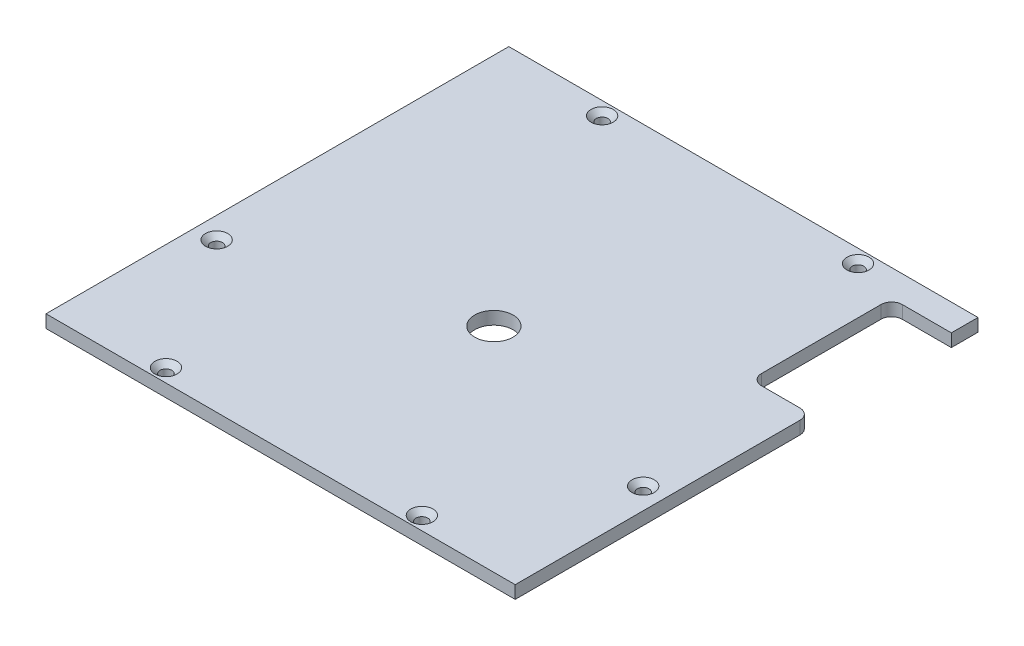
ISO-10303-21;
HEADER;
FILE_DESCRIPTION(('STEP AP214'),'2;1');
FILE_NAME('part.step','',(''),(''),'','','');
FILE_SCHEMA(('AUTOMOTIVE_DESIGN { 1 0 10303 214 1 1 1 1 }'));
ENDSEC;
DATA;
#1=APPLICATION_CONTEXT('core data for automotive mechanical design processes');
#2=APPLICATION_PROTOCOL_DEFINITION('international standard','automotive_design',2000,#1);
#3=PRODUCT_CONTEXT('',#1,'mechanical');
#4=PRODUCT('Part','Part','',(#3));
#5=PRODUCT_RELATED_PRODUCT_CATEGORY('part','',(#4));
#6=PRODUCT_DEFINITION_FORMATION('','',#4);
#7=PRODUCT_DEFINITION_CONTEXT('part definition',#1,'design');
#8=PRODUCT_DEFINITION('design','',#6,#7);
#9=PRODUCT_DEFINITION_SHAPE('','',#8);
#10=(LENGTH_UNIT() NAMED_UNIT(*) SI_UNIT(.MILLI.,.METRE.));
#11=(NAMED_UNIT(*) PLANE_ANGLE_UNIT() SI_UNIT($,.RADIAN.));
#12=(NAMED_UNIT(*) SI_UNIT($,.STERADIAN.) SOLID_ANGLE_UNIT());
#13=UNCERTAINTY_MEASURE_WITH_UNIT(LENGTH_MEASURE(1.E-05),#10,'distance_accuracy_value','');
#14=(GEOMETRIC_REPRESENTATION_CONTEXT(3) GLOBAL_UNCERTAINTY_ASSIGNED_CONTEXT((#13)) GLOBAL_UNIT_ASSIGNED_CONTEXT((#10,
#11,#12)) REPRESENTATION_CONTEXT('',''));
#15=CARTESIAN_POINT('',(0.,0.,0.));
#16=DIRECTION('',(0.,0.,1.));
#17=DIRECTION('',(1.,0.,0.));
#18=AXIS2_PLACEMENT_3D('',#15,#16,#17);
#19=CARTESIAN_POINT('',(0.,6.,0.));
#20=DIRECTION('',(0.,-1.,0.));
#21=DIRECTION('',(0.,0.,-1.));
#22=AXIS2_PLACEMENT_3D('',#19,#20,#21);
#23=PLANE('',#22);
#24=CARTESIAN_POINT('',(-100.,6.,38.5));
#25=DIRECTION('',(0.,1.,0.));
#26=DIRECTION('',(0.,0.,1.));
#27=AXIS2_PLACEMENT_3D('',#24,#25,#26);
#28=CIRCLE('',#27,5.2);
#29=CARTESIAN_POINT('',(-100.,6.,43.7));
#30=VERTEX_POINT('',#29);
#31=EDGE_CURVE('E524',#30,#30,#28,.T.);
#32=ORIENTED_EDGE('',*,*,#31,.F.);
#33=EDGE_LOOP('',(#32));
#34=FACE_BOUND('',#33,.T.);
#35=CARTESIAN_POINT('',(-60.,6.,102.25));
#36=DIRECTION('',(0.,1.,0.));
#37=DIRECTION('',(0.,0.,1.));
#38=AXIS2_PLACEMENT_3D('',#35,#36,#37);
#39=CIRCLE('',#38,5.2);
#40=CARTESIAN_POINT('',(-60.,6.,107.45));
#41=VERTEX_POINT('',#40);
#42=EDGE_CURVE('E534',#41,#41,#39,.T.);
#43=ORIENTED_EDGE('',*,*,#42,.F.);
#44=EDGE_LOOP('',(#43));
#45=FACE_BOUND('',#44,.T.);
#46=CARTESIAN_POINT('',(60.,6.,102.25));
#47=DIRECTION('',(0.,1.,0.));
#48=DIRECTION('',(0.,0.,1.));
#49=AXIS2_PLACEMENT_3D('',#46,#47,#48);
#50=CIRCLE('',#49,5.2);
#51=CARTESIAN_POINT('',(60.,6.,107.45));
#52=VERTEX_POINT('',#51);
#53=EDGE_CURVE('E546',#52,#52,#50,.T.);
#54=ORIENTED_EDGE('',*,*,#53,.F.);
#55=EDGE_LOOP('',(#54));
#56=FACE_BOUND('',#55,.T.);
#57=CARTESIAN_POINT('',(100.,6.,38.5));
#58=DIRECTION('',(0.,1.,0.));
#59=DIRECTION('',(0.,0.,1.));
#60=AXIS2_PLACEMENT_3D('',#57,#58,#59);
#61=CIRCLE('',#60,5.2);
#62=CARTESIAN_POINT('',(100.,6.,43.7));
#63=VERTEX_POINT('',#62);
#64=EDGE_CURVE('E558',#63,#63,#61,.T.);
#65=ORIENTED_EDGE('',*,*,#64,.F.);
#66=EDGE_LOOP('',(#65));
#67=FACE_BOUND('',#66,.T.);
#68=CARTESIAN_POINT('',(60.,6.,-102.25));
#69=DIRECTION('',(0.,1.,0.));
#70=DIRECTION('',(0.,0.,1.));
#71=AXIS2_PLACEMENT_3D('',#68,#69,#70);
#72=CIRCLE('',#71,5.2);
#73=CARTESIAN_POINT('',(60.,6.,-97.05));
#74=VERTEX_POINT('',#73);
#75=EDGE_CURVE('E582',#74,#74,#72,.T.);
#76=ORIENTED_EDGE('',*,*,#75,.F.);
#77=EDGE_LOOP('',(#76));
#78=FACE_BOUND('',#77,.T.);
#79=CARTESIAN_POINT('',(0.,6.,8.49999999999996));
#80=DIRECTION('',(0.,1.,0.));
#81=DIRECTION('',(0.,0.,1.));
#82=AXIS2_PLACEMENT_3D('',#79,#80,#81);
#83=CIRCLE('',#82,9.);
#84=CARTESIAN_POINT('',(0.,6.,17.5));
#85=VERTEX_POINT('',#84);
#86=EDGE_CURVE('E242',#85,#85,#83,.T.);
#87=ORIENTED_EDGE('',*,*,#86,.F.);
#88=EDGE_LOOP('',(#87));
#89=FACE_BOUND('',#88,.T.);
#90=DIRECTION('',(0.,0.,-1.));
#91=VECTOR('',#90,1.);
#92=CARTESIAN_POINT('',(110.,6.,108.5));
#93=LINE('',#92,#91);
#94=CARTESIAN_POINT('',(110.,6.,108.5));
#95=VERTEX_POINT('',#94);
#96=CARTESIAN_POINT('',(110.,6.,-25.));
#97=VERTEX_POINT('',#96);
#98=EDGE_CURVE('E246',#95,#97,#93,.T.);
#99=ORIENTED_EDGE('',*,*,#98,.T.);
#100=CARTESIAN_POINT('',(105.,6.,-25.));
#101=DIRECTION('',(0.,-1.,0.));
#102=DIRECTION('',(0.,0.,-1.));
#103=AXIS2_PLACEMENT_3D('',#100,#101,#102);
#104=CIRCLE('',#103,5.);
#105=CARTESIAN_POINT('',(105.,6.,-30.));
#106=VERTEX_POINT('',#105);
#107=EDGE_CURVE('E184',#97,#106,#104,.F.);
#108=ORIENTED_EDGE('',*,*,#107,.T.);
#109=DIRECTION('',(1.,0.,0.));
#110=VECTOR('',#109,1.);
#111=CARTESIAN_POINT('',(82.,6.,-30.));
#112=LINE('',#111,#110);
#113=CARTESIAN_POINT('',(87.,6.,-30.));
#114=VERTEX_POINT('',#113);
#115=EDGE_CURVE('E221',#114,#106,#112,.T.);
#116=ORIENTED_EDGE('',*,*,#115,.F.);
#117=CARTESIAN_POINT('',(87.,6.,-35.));
#118=DIRECTION('',(0.,-1.,0.));
#119=DIRECTION('',(0.,0.,-1.));
#120=AXIS2_PLACEMENT_3D('',#117,#118,#119);
#121=CIRCLE('',#120,5.);
#122=CARTESIAN_POINT('',(82.,6.,-35.));
#123=VERTEX_POINT('',#122);
#124=EDGE_CURVE('E205',#114,#123,#121,.T.);
#125=ORIENTED_EDGE('',*,*,#124,.T.);
#126=DIRECTION('',(0.,0.,1.));
#127=VECTOR('',#126,1.);
#128=CARTESIAN_POINT('',(82.,6.,-96.));
#129=LINE('',#128,#127);
#130=CARTESIAN_POINT('',(82.,6.,-91.));
#131=VERTEX_POINT('',#130);
#132=EDGE_CURVE('E216',#131,#123,#129,.T.);
#133=ORIENTED_EDGE('',*,*,#132,.F.);
#134=CARTESIAN_POINT('',(87.,6.,-91.));
#135=DIRECTION('',(0.,-1.,0.));
#136=DIRECTION('',(0.,0.,-1.));
#137=AXIS2_PLACEMENT_3D('',#134,#135,#136);
#138=CIRCLE('',#137,5.);
#139=CARTESIAN_POINT('',(87.,6.,-96.));
#140=VERTEX_POINT('',#139);
#141=EDGE_CURVE('E48',#131,#140,#138,.T.);
#142=ORIENTED_EDGE('',*,*,#141,.T.);
#143=DIRECTION('',(-1.,0.,0.));
#144=VECTOR('',#143,1.);
#145=CARTESIAN_POINT('',(82.,6.,-96.));
#146=LINE('',#145,#144);
#147=CARTESIAN_POINT('',(110.,6.,-96.));
#148=VERTEX_POINT('',#147);
#149=EDGE_CURVE('E215',#148,#140,#146,.T.);
#150=ORIENTED_EDGE('',*,*,#149,.F.);
#151=CARTESIAN_POINT('',(110.,6.,-108.5));
#152=VERTEX_POINT('',#151);
#153=EDGE_CURVE('E139',#148,#152,#93,.T.);
#154=ORIENTED_EDGE('',*,*,#153,.T.);
#155=DIRECTION('',(-1.,0.,0.));
#156=VECTOR('',#155,1.);
#157=CARTESIAN_POINT('',(-110.,6.,-108.5));
#158=LINE('',#157,#156);
#159=CARTESIAN_POINT('',(-110.,6.,-108.5));
#160=VERTEX_POINT('',#159);
#161=EDGE_CURVE('E249',#152,#160,#158,.T.);
#162=ORIENTED_EDGE('',*,*,#161,.T.);
#163=DIRECTION('',(0.,0.,1.));
#164=VECTOR('',#163,1.);
#165=CARTESIAN_POINT('',(-110.,6.,108.5));
#166=LINE('',#165,#164);
#167=CARTESIAN_POINT('',(-110.,6.,108.5));
#168=VERTEX_POINT('',#167);
#169=EDGE_CURVE('E251',#160,#168,#166,.T.);
#170=ORIENTED_EDGE('',*,*,#169,.T.);
#171=DIRECTION('',(1.,0.,0.));
#172=VECTOR('',#171,1.);
#173=CARTESIAN_POINT('',(-110.,6.,108.5));
#174=LINE('',#173,#172);
#175=EDGE_CURVE('E155',#168,#95,#174,.T.);
#176=ORIENTED_EDGE('',*,*,#175,.T.);
#177=EDGE_LOOP('',(#99,#108,#116,#125,#133,#142,#150,#154,#162,#170,#176));
#178=FACE_BOUND('',#177,.T.);
#179=CARTESIAN_POINT('',(-60.,6.,-102.25));
#180=DIRECTION('',(0.,1.,0.));
#181=DIRECTION('',(0.,0.,1.));
#182=AXIS2_PLACEMENT_3D('',#179,#180,#181);
#183=CIRCLE('',#182,5.2);
#184=CARTESIAN_POINT('',(-60.,6.,-97.05));
#185=VERTEX_POINT('',#184);
#186=EDGE_CURVE('E570',#185,#185,#183,.T.);
#187=ORIENTED_EDGE('',*,*,#186,.F.);
#188=EDGE_LOOP('',(#187));
#189=FACE_BOUND('',#188,.T.);
#190=ADVANCED_FACE('F39',(#34,#45,#56,#67,#78,#89,#178,#189),#23,.F.);
#191=CARTESIAN_POINT('',(110.,6.,108.5));
#192=DIRECTION('',(-1.,0.,0.));
#193=DIRECTION('',(0.,0.,1.));
#194=AXIS2_PLACEMENT_3D('',#191,#192,#193);
#195=PLANE('',#194);
#196=ORIENTED_EDGE('',*,*,#153,.F.);
#197=DIRECTION('',(0.,1.,0.));
#198=VECTOR('',#197,1.);
#199=CARTESIAN_POINT('',(110.,0.,-96.));
#200=LINE('',#199,#198);
#201=CARTESIAN_POINT('',(110.,0.,-96.));
#202=VERTEX_POINT('',#201);
#203=EDGE_CURVE('E125',#202,#148,#200,.T.);
#204=ORIENTED_EDGE('',*,*,#203,.F.);
#205=DIRECTION('',(0.,0.,-1.));
#206=VECTOR('',#205,1.);
#207=CARTESIAN_POINT('',(110.,0.,108.5));
#208=LINE('',#207,#206);
#209=CARTESIAN_POINT('',(110.,0.,-108.5));
#210=VERTEX_POINT('',#209);
#211=EDGE_CURVE('E137',#202,#210,#208,.T.);
#212=ORIENTED_EDGE('',*,*,#211,.T.);
#213=DIRECTION('',(0.,-1.,0.));
#214=VECTOR('',#213,1.);
#215=CARTESIAN_POINT('',(110.,6.,-108.5));
#216=LINE('',#215,#214);
#217=EDGE_CURVE('E177',#152,#210,#216,.T.);
#218=ORIENTED_EDGE('',*,*,#217,.F.);
#219=EDGE_LOOP('',(#196,#204,#212,#218));
#220=FACE_BOUND('',#219,.T.);
#221=ADVANCED_FACE('F135',(#220),#195,.F.);
#222=CARTESIAN_POINT('',(110.,0.,108.5));
#223=VERTEX_POINT('',#222);
#224=CARTESIAN_POINT('',(110.,0.,-25.));
#225=VERTEX_POINT('',#224);
#226=EDGE_CURVE('E149',#223,#225,#208,.T.);
#227=ORIENTED_EDGE('',*,*,#226,.T.);
#228=DIRECTION('',(0.,1.,0.));
#229=VECTOR('',#228,1.);
#230=CARTESIAN_POINT('',(110.,6.,-25.));
#231=LINE('',#230,#229);
#232=EDGE_CURVE('E180',#225,#97,#231,.T.);
#233=ORIENTED_EDGE('',*,*,#232,.T.);
#234=ORIENTED_EDGE('',*,*,#98,.F.);
#235=DIRECTION('',(0.,-1.,0.));
#236=VECTOR('',#235,1.);
#237=CARTESIAN_POINT('',(110.,6.,108.5));
#238=LINE('',#237,#236);
#239=EDGE_CURVE('E165',#95,#223,#238,.T.);
#240=ORIENTED_EDGE('',*,*,#239,.T.);
#241=EDGE_LOOP('',(#227,#233,#234,#240));
#242=FACE_BOUND('',#241,.T.);
#243=ADVANCED_FACE('F264',(#242),#195,.F.);
#244=CARTESIAN_POINT('',(-110.,6.,-108.5));
#245=DIRECTION('',(0.,0.,1.));
#246=DIRECTION('',(1.,0.,0.));
#247=AXIS2_PLACEMENT_3D('',#244,#245,#246);
#248=PLANE('',#247);
#249=DIRECTION('',(-1.,0.,0.));
#250=VECTOR('',#249,1.);
#251=CARTESIAN_POINT('',(-110.,0.,-108.5));
#252=LINE('',#251,#250);
#253=CARTESIAN_POINT('',(-110.,0.,-108.5));
#254=VERTEX_POINT('',#253);
#255=EDGE_CURVE('E146',#210,#254,#252,.T.);
#256=ORIENTED_EDGE('',*,*,#255,.T.);
#257=DIRECTION('',(0.,-1.,0.));
#258=VECTOR('',#257,1.);
#259=CARTESIAN_POINT('',(-110.,6.,-108.5));
#260=LINE('',#259,#258);
#261=EDGE_CURVE('E173',#160,#254,#260,.T.);
#262=ORIENTED_EDGE('',*,*,#261,.F.);
#263=ORIENTED_EDGE('',*,*,#161,.F.);
#264=ORIENTED_EDGE('',*,*,#217,.T.);
#265=EDGE_LOOP('',(#256,#262,#263,#264));
#266=FACE_BOUND('',#265,.T.);
#267=ADVANCED_FACE('F282',(#266),#248,.F.);
#268=CARTESIAN_POINT('',(-110.,6.,108.5));
#269=DIRECTION('',(1.,0.,0.));
#270=DIRECTION('',(0.,0.,-1.));
#271=AXIS2_PLACEMENT_3D('',#268,#269,#270);
#272=PLANE('',#271);
#273=DIRECTION('',(0.,0.,1.));
#274=VECTOR('',#273,1.);
#275=CARTESIAN_POINT('',(-110.,0.,108.5));
#276=LINE('',#275,#274);
#277=CARTESIAN_POINT('',(-110.,0.,108.5));
#278=VERTEX_POINT('',#277);
#279=EDGE_CURVE('E159',#254,#278,#276,.T.);
#280=ORIENTED_EDGE('',*,*,#279,.T.);
#281=DIRECTION('',(0.,-1.,0.));
#282=VECTOR('',#281,1.);
#283=CARTESIAN_POINT('',(-110.,6.,108.5));
#284=LINE('',#283,#282);
#285=EDGE_CURVE('E169',#168,#278,#284,.T.);
#286=ORIENTED_EDGE('',*,*,#285,.F.);
#287=ORIENTED_EDGE('',*,*,#169,.F.);
#288=ORIENTED_EDGE('',*,*,#261,.T.);
#289=EDGE_LOOP('',(#280,#286,#287,#288));
#290=FACE_BOUND('',#289,.T.);
#291=ADVANCED_FACE('F278',(#290),#272,.F.);
#292=CARTESIAN_POINT('',(-110.,6.,108.5));
#293=DIRECTION('',(0.,0.,-1.));
#294=DIRECTION('',(-1.,0.,0.));
#295=AXIS2_PLACEMENT_3D('',#292,#293,#294);
#296=PLANE('',#295);
#297=DIRECTION('',(1.,0.,0.));
#298=VECTOR('',#297,1.);
#299=CARTESIAN_POINT('',(-110.,0.,108.5));
#300=LINE('',#299,#298);
#301=EDGE_CURVE('E162',#278,#223,#300,.T.);
#302=ORIENTED_EDGE('',*,*,#301,.T.);
#303=ORIENTED_EDGE('',*,*,#239,.F.);
#304=ORIENTED_EDGE('',*,*,#175,.F.);
#305=ORIENTED_EDGE('',*,*,#285,.T.);
#306=EDGE_LOOP('',(#302,#303,#304,#305));
#307=FACE_BOUND('',#306,.T.);
#308=ADVANCED_FACE('F260',(#307),#296,.F.);
#309=CARTESIAN_POINT('',(0.,0.,0.));
#310=DIRECTION('',(0.,-1.,0.));
#311=DIRECTION('',(0.,0.,-1.));
#312=AXIS2_PLACEMENT_3D('',#309,#310,#311);
#313=PLANE('',#312);
#314=CARTESIAN_POINT('',(-100.,0.,38.5));
#315=DIRECTION('',(0.,1.,0.));
#316=DIRECTION('',(0.,0.,1.));
#317=AXIS2_PLACEMENT_3D('',#314,#315,#316);
#318=CIRCLE('',#317,2.74999999999999);
#319=CARTESIAN_POINT('',(-100.,0.,41.25));
#320=VERTEX_POINT('',#319);
#321=EDGE_CURVE('E528',#320,#320,#318,.T.);
#322=ORIENTED_EDGE('',*,*,#321,.T.);
#323=EDGE_LOOP('',(#322));
#324=FACE_BOUND('',#323,.T.);
#325=CARTESIAN_POINT('',(-60.,0.,102.25));
#326=DIRECTION('',(0.,1.,0.));
#327=DIRECTION('',(0.,0.,1.));
#328=AXIS2_PLACEMENT_3D('',#325,#326,#327);
#329=CIRCLE('',#328,2.74999999999999);
#330=CARTESIAN_POINT('',(-60.,0.,105.));
#331=VERTEX_POINT('',#330);
#332=EDGE_CURVE('E542',#331,#331,#329,.T.);
#333=ORIENTED_EDGE('',*,*,#332,.T.);
#334=EDGE_LOOP('',(#333));
#335=FACE_BOUND('',#334,.T.);
#336=CARTESIAN_POINT('',(60.,0.,102.25));
#337=DIRECTION('',(0.,1.,0.));
#338=DIRECTION('',(0.,0.,1.));
#339=AXIS2_PLACEMENT_3D('',#336,#337,#338);
#340=CIRCLE('',#339,2.74999999999999);
#341=CARTESIAN_POINT('',(60.,0.,105.));
#342=VERTEX_POINT('',#341);
#343=EDGE_CURVE('E554',#342,#342,#340,.T.);
#344=ORIENTED_EDGE('',*,*,#343,.T.);
#345=EDGE_LOOP('',(#344));
#346=FACE_BOUND('',#345,.T.);
#347=CARTESIAN_POINT('',(100.,0.,38.5));
#348=DIRECTION('',(0.,1.,0.));
#349=DIRECTION('',(0.,0.,1.));
#350=AXIS2_PLACEMENT_3D('',#347,#348,#349);
#351=CIRCLE('',#350,2.74999999999999);
#352=CARTESIAN_POINT('',(100.,0.,41.25));
#353=VERTEX_POINT('',#352);
#354=EDGE_CURVE('E566',#353,#353,#351,.T.);
#355=ORIENTED_EDGE('',*,*,#354,.T.);
#356=EDGE_LOOP('',(#355));
#357=FACE_BOUND('',#356,.T.);
#358=CARTESIAN_POINT('',(-60.,0.,-102.25));
#359=DIRECTION('',(0.,1.,0.));
#360=DIRECTION('',(0.,0.,1.));
#361=AXIS2_PLACEMENT_3D('',#358,#359,#360);
#362=CIRCLE('',#361,2.74999999999999);
#363=CARTESIAN_POINT('',(-60.,0.,-99.5));
#364=VERTEX_POINT('',#363);
#365=EDGE_CURVE('E578',#364,#364,#362,.T.);
#366=ORIENTED_EDGE('',*,*,#365,.T.);
#367=EDGE_LOOP('',(#366));
#368=FACE_BOUND('',#367,.T.);
#369=CARTESIAN_POINT('',(60.,0.,-102.25));
#370=DIRECTION('',(0.,1.,0.));
#371=DIRECTION('',(0.,0.,1.));
#372=AXIS2_PLACEMENT_3D('',#369,#370,#371);
#373=CIRCLE('',#372,2.74999999999999);
#374=CARTESIAN_POINT('',(60.,0.,-99.5));
#375=VERTEX_POINT('',#374);
#376=EDGE_CURVE('E230',#375,#375,#373,.T.);
#377=ORIENTED_EDGE('',*,*,#376,.T.);
#378=EDGE_LOOP('',(#377));
#379=FACE_BOUND('',#378,.T.);
#380=DIRECTION('',(1.,0.,0.));
#381=VECTOR('',#380,1.);
#382=CARTESIAN_POINT('',(82.,0.,-30.));
#383=LINE('',#382,#381);
#384=CARTESIAN_POINT('',(87.,0.,-30.));
#385=VERTEX_POINT('',#384);
#386=CARTESIAN_POINT('',(105.,0.,-30.));
#387=VERTEX_POINT('',#386);
#388=EDGE_CURVE('E131',#385,#387,#383,.T.);
#389=ORIENTED_EDGE('',*,*,#388,.T.);
#390=CARTESIAN_POINT('',(105.,0.,-25.));
#391=DIRECTION('',(0.,-1.,0.));
#392=DIRECTION('',(0.,0.,-1.));
#393=AXIS2_PLACEMENT_3D('',#390,#391,#392);
#394=CIRCLE('',#393,5.);
#395=EDGE_CURVE('E194',#387,#225,#394,.T.);
#396=ORIENTED_EDGE('',*,*,#395,.T.);
#397=ORIENTED_EDGE('',*,*,#226,.F.);
#398=ORIENTED_EDGE('',*,*,#301,.F.);
#399=ORIENTED_EDGE('',*,*,#279,.F.);
#400=ORIENTED_EDGE('',*,*,#255,.F.);
#401=ORIENTED_EDGE('',*,*,#211,.F.);
#402=DIRECTION('',(-1.,0.,0.));
#403=VECTOR('',#402,1.);
#404=CARTESIAN_POINT('',(82.,0.,-96.));
#405=LINE('',#404,#403);
#406=CARTESIAN_POINT('',(87.,0.,-96.));
#407=VERTEX_POINT('',#406);
#408=EDGE_CURVE('E121',#202,#407,#405,.T.);
#409=ORIENTED_EDGE('',*,*,#408,.T.);
#410=CARTESIAN_POINT('',(87.,0.,-91.));
#411=DIRECTION('',(0.,-1.,0.));
#412=DIRECTION('',(0.,0.,-1.));
#413=AXIS2_PLACEMENT_3D('',#410,#411,#412);
#414=CIRCLE('',#413,5.);
#415=CARTESIAN_POINT('',(82.,0.,-91.));
#416=VERTEX_POINT('',#415);
#417=EDGE_CURVE('E11',#407,#416,#414,.F.);
#418=ORIENTED_EDGE('',*,*,#417,.T.);
#419=DIRECTION('',(0.,0.,1.));
#420=VECTOR('',#419,1.);
#421=CARTESIAN_POINT('',(82.,0.,-96.));
#422=LINE('',#421,#420);
#423=CARTESIAN_POINT('',(82.,0.,-35.));
#424=VERTEX_POINT('',#423);
#425=EDGE_CURVE('E220',#416,#424,#422,.T.);
#426=ORIENTED_EDGE('',*,*,#425,.T.);
#427=CARTESIAN_POINT('',(87.,0.,-35.));
#428=DIRECTION('',(0.,-1.,0.));
#429=DIRECTION('',(0.,0.,-1.));
#430=AXIS2_PLACEMENT_3D('',#427,#428,#429);
#431=CIRCLE('',#430,5.);
#432=EDGE_CURVE('E208',#424,#385,#431,.F.);
#433=ORIENTED_EDGE('',*,*,#432,.T.);
#434=EDGE_LOOP('',(#389,#396,#397,#398,#399,#400,#401,#409,#418,#426,#433));
#435=FACE_BOUND('',#434,.T.);
#436=CARTESIAN_POINT('',(0.,0.,8.49999999999996));
#437=DIRECTION('',(0.,1.,0.));
#438=DIRECTION('',(0.,0.,1.));
#439=AXIS2_PLACEMENT_3D('',#436,#437,#438);
#440=CIRCLE('',#439,9.);
#441=CARTESIAN_POINT('',(0.,0.,17.5));
#442=VERTEX_POINT('',#441);
#443=EDGE_CURVE('E235',#442,#442,#440,.T.);
#444=ORIENTED_EDGE('',*,*,#443,.T.);
#445=EDGE_LOOP('',(#444));
#446=FACE_BOUND('',#445,.T.);
#447=ADVANCED_FACE('F143',(#324,#335,#346,#357,#368,#379,#435,#446),#313,.T.);
#448=CARTESIAN_POINT('',(0.,0.,8.49999999999996));
#449=DIRECTION('',(0.,1.,0.));
#450=DIRECTION('',(0.,0.,1.));
#451=AXIS2_PLACEMENT_3D('',#448,#449,#450);
#452=CYLINDRICAL_SURFACE('',#451,9.);
#453=ORIENTED_EDGE('',*,*,#443,.F.);
#454=EDGE_LOOP('',(#453));
#455=FACE_BOUND('',#454,.T.);
#456=ORIENTED_EDGE('',*,*,#86,.T.);
#457=EDGE_LOOP('',(#456));
#458=FACE_BOUND('',#457,.T.);
#459=ADVANCED_FACE('F302',(#455,#458),#452,.F.);
#460=CARTESIAN_POINT('',(82.,0.,-96.));
#461=DIRECTION('',(-1.,0.,0.));
#462=DIRECTION('',(0.,0.,1.));
#463=AXIS2_PLACEMENT_3D('',#460,#461,#462);
#464=PLANE('',#463);
#465=ORIENTED_EDGE('',*,*,#132,.T.);
#466=DIRECTION('',(0.,1.,0.));
#467=VECTOR('',#466,1.);
#468=CARTESIAN_POINT('',(82.,0.,-35.));
#469=LINE('',#468,#467);
#470=EDGE_CURVE('E55',#123,#424,#469,.F.);
#471=ORIENTED_EDGE('',*,*,#470,.T.);
#472=ORIENTED_EDGE('',*,*,#425,.F.);
#473=DIRECTION('',(0.,1.,0.));
#474=VECTOR('',#473,1.);
#475=CARTESIAN_POINT('',(82.,6.,-91.));
#476=LINE('',#475,#474);
#477=EDGE_CURVE('E197',#416,#131,#476,.T.);
#478=ORIENTED_EDGE('',*,*,#477,.T.);
#479=EDGE_LOOP('',(#465,#471,#472,#478));
#480=FACE_BOUND('',#479,.T.);
#481=ADVANCED_FACE('F223',(#480),#464,.F.);
#482=CARTESIAN_POINT('',(82.,0.,-96.));
#483=DIRECTION('',(0.,0.,-1.));
#484=DIRECTION('',(-1.,0.,0.));
#485=AXIS2_PLACEMENT_3D('',#482,#483,#484);
#486=PLANE('',#485);
#487=ORIENTED_EDGE('',*,*,#149,.T.);
#488=DIRECTION('',(0.,1.,0.));
#489=VECTOR('',#488,1.);
#490=CARTESIAN_POINT('',(87.,0.,-96.));
#491=LINE('',#490,#489);
#492=EDGE_CURVE('E128',#140,#407,#491,.F.);
#493=ORIENTED_EDGE('',*,*,#492,.T.);
#494=ORIENTED_EDGE('',*,*,#408,.F.);
#495=ORIENTED_EDGE('',*,*,#203,.T.);
#496=EDGE_LOOP('',(#487,#493,#494,#495));
#497=FACE_BOUND('',#496,.T.);
#498=ADVANCED_FACE('F124',(#497),#486,.F.);
#499=CARTESIAN_POINT('',(82.,0.,-30.));
#500=DIRECTION('',(0.,0.,1.));
#501=DIRECTION('',(1.,0.,0.));
#502=AXIS2_PLACEMENT_3D('',#499,#500,#501);
#503=PLANE('',#502);
#504=ORIENTED_EDGE('',*,*,#115,.T.);
#505=DIRECTION('',(0.,1.,0.));
#506=VECTOR('',#505,1.);
#507=CARTESIAN_POINT('',(105.,0.,-30.));
#508=LINE('',#507,#506);
#509=EDGE_CURVE('E191',#106,#387,#508,.F.);
#510=ORIENTED_EDGE('',*,*,#509,.T.);
#511=ORIENTED_EDGE('',*,*,#388,.F.);
#512=DIRECTION('',(0.,1.,0.));
#513=VECTOR('',#512,1.);
#514=CARTESIAN_POINT('',(87.,6.,-30.));
#515=LINE('',#514,#513);
#516=EDGE_CURVE('E187',#385,#114,#515,.T.);
#517=ORIENTED_EDGE('',*,*,#516,.T.);
#518=EDGE_LOOP('',(#504,#510,#511,#517));
#519=FACE_BOUND('',#518,.T.);
#520=ADVANCED_FACE('F272',(#519),#503,.F.);
#521=CARTESIAN_POINT('',(105.,6.,-25.));
#522=DIRECTION('',(0.,1.,0.));
#523=DIRECTION('',(0.,0.,1.));
#524=AXIS2_PLACEMENT_3D('',#521,#522,#523);
#525=CYLINDRICAL_SURFACE('',#524,5.);
#526=ORIENTED_EDGE('',*,*,#395,.F.);
#527=ORIENTED_EDGE('',*,*,#509,.F.);
#528=ORIENTED_EDGE('',*,*,#107,.F.);
#529=ORIENTED_EDGE('',*,*,#232,.F.);
#530=EDGE_LOOP('',(#526,#527,#528,#529));
#531=FACE_BOUND('',#530,.T.);
#532=ADVANCED_FACE('F268',(#531),#525,.T.);
#533=CARTESIAN_POINT('',(87.,0.,-35.));
#534=DIRECTION('',(0.,-1.,0.));
#535=DIRECTION('',(0.,0.,-1.));
#536=AXIS2_PLACEMENT_3D('',#533,#534,#535);
#537=CYLINDRICAL_SURFACE('',#536,5.);
#538=ORIENTED_EDGE('',*,*,#432,.F.);
#539=ORIENTED_EDGE('',*,*,#470,.F.);
#540=ORIENTED_EDGE('',*,*,#124,.F.);
#541=ORIENTED_EDGE('',*,*,#516,.F.);
#542=EDGE_LOOP('',(#538,#539,#540,#541));
#543=FACE_BOUND('',#542,.T.);
#544=ADVANCED_FACE('F276',(#543),#537,.F.);
#545=CARTESIAN_POINT('',(87.,0.,-91.));
#546=DIRECTION('',(0.,-1.,0.));
#547=DIRECTION('',(0.,0.,-1.));
#548=AXIS2_PLACEMENT_3D('',#545,#546,#547);
#549=CYLINDRICAL_SURFACE('',#548,5.);
#550=ORIENTED_EDGE('',*,*,#417,.F.);
#551=ORIENTED_EDGE('',*,*,#492,.F.);
#552=ORIENTED_EDGE('',*,*,#141,.F.);
#553=ORIENTED_EDGE('',*,*,#477,.F.);
#554=EDGE_LOOP('',(#550,#551,#552,#553));
#555=FACE_BOUND('',#554,.T.);
#556=ADVANCED_FACE('F41',(#555),#549,.F.);
#557=CARTESIAN_POINT('',(60.,6.,-102.25));
#558=DIRECTION('',(0.,1.,0.));
#559=DIRECTION('',(0.,0.,1.));
#560=AXIS2_PLACEMENT_3D('',#557,#558,#559);
#561=CYLINDRICAL_SURFACE('',#560,2.75);
#562=ORIENTED_EDGE('',*,*,#376,.F.);
#563=EDGE_LOOP('',(#562));
#564=FACE_BOUND('',#563,.T.);
#565=CARTESIAN_POINT('',(60.,3.55,-102.25));
#566=DIRECTION('',(0.,1.,0.));
#567=DIRECTION('',(0.,0.,1.));
#568=AXIS2_PLACEMENT_3D('',#565,#566,#567);
#569=CIRCLE('',#568,2.75);
#570=CARTESIAN_POINT('',(60.,3.55,-99.5));
#571=VERTEX_POINT('',#570);
#572=EDGE_CURVE('E585',#571,#571,#569,.T.);
#573=ORIENTED_EDGE('',*,*,#572,.T.);
#574=EDGE_LOOP('',(#573));
#575=FACE_BOUND('',#574,.T.);
#576=ADVANCED_FACE('F359',(#564,#575),#561,.F.);
#577=CARTESIAN_POINT('',(60.,6.,-102.25));
#578=DIRECTION('',(0.,1.,0.));
#579=DIRECTION('',(0.,0.,1.));
#580=AXIS2_PLACEMENT_3D('',#577,#578,#579);
#581=CONICAL_SURFACE('',#580,5.2,0.785398163397447);
#582=ORIENTED_EDGE('',*,*,#572,.F.);
#583=EDGE_LOOP('',(#582));
#584=FACE_BOUND('',#583,.T.);
#585=ORIENTED_EDGE('',*,*,#75,.T.);
#586=EDGE_LOOP('',(#585));
#587=FACE_BOUND('',#586,.T.);
#588=ADVANCED_FACE('F364',(#584,#587),#581,.F.);
#589=CARTESIAN_POINT('',(-60.,6.,-102.25));
#590=DIRECTION('',(0.,1.,0.));
#591=DIRECTION('',(0.,0.,1.));
#592=AXIS2_PLACEMENT_3D('',#589,#590,#591);
#593=CYLINDRICAL_SURFACE('',#592,2.75);
#594=ORIENTED_EDGE('',*,*,#365,.F.);
#595=EDGE_LOOP('',(#594));
#596=FACE_BOUND('',#595,.T.);
#597=CARTESIAN_POINT('',(-60.,3.55,-102.25));
#598=DIRECTION('',(0.,1.,0.));
#599=DIRECTION('',(0.,0.,1.));
#600=AXIS2_PLACEMENT_3D('',#597,#598,#599);
#601=CIRCLE('',#600,2.75);
#602=CARTESIAN_POINT('',(-60.,3.55,-99.5));
#603=VERTEX_POINT('',#602);
#604=EDGE_CURVE('E574',#603,#603,#601,.T.);
#605=ORIENTED_EDGE('',*,*,#604,.T.);
#606=EDGE_LOOP('',(#605));
#607=FACE_BOUND('',#606,.T.);
#608=ADVANCED_FACE('F372',(#596,#607),#593,.F.);
#609=CARTESIAN_POINT('',(-60.,6.,-102.25));
#610=DIRECTION('',(0.,1.,0.));
#611=DIRECTION('',(0.,0.,1.));
#612=AXIS2_PLACEMENT_3D('',#609,#610,#611);
#613=CONICAL_SURFACE('',#612,5.2,0.785398163397448);
#614=ORIENTED_EDGE('',*,*,#604,.F.);
#615=EDGE_LOOP('',(#614));
#616=FACE_BOUND('',#615,.T.);
#617=ORIENTED_EDGE('',*,*,#186,.T.);
#618=EDGE_LOOP('',(#617));
#619=FACE_BOUND('',#618,.T.);
#620=ADVANCED_FACE('F380',(#616,#619),#613,.F.);
#621=CARTESIAN_POINT('',(100.,6.,38.5));
#622=DIRECTION('',(0.,1.,0.));
#623=DIRECTION('',(0.,0.,1.));
#624=AXIS2_PLACEMENT_3D('',#621,#622,#623);
#625=CYLINDRICAL_SURFACE('',#624,2.75);
#626=ORIENTED_EDGE('',*,*,#354,.F.);
#627=EDGE_LOOP('',(#626));
#628=FACE_BOUND('',#627,.T.);
#629=CARTESIAN_POINT('',(100.,3.55,38.5));
#630=DIRECTION('',(0.,1.,0.));
#631=DIRECTION('',(0.,0.,1.));
#632=AXIS2_PLACEMENT_3D('',#629,#630,#631);
#633=CIRCLE('',#632,2.75);
#634=CARTESIAN_POINT('',(100.,3.55,41.25));
#635=VERTEX_POINT('',#634);
#636=EDGE_CURVE('E562',#635,#635,#633,.T.);
#637=ORIENTED_EDGE('',*,*,#636,.T.);
#638=EDGE_LOOP('',(#637));
#639=FACE_BOUND('',#638,.T.);
#640=ADVANCED_FACE('F388',(#628,#639),#625,.F.);
#641=CARTESIAN_POINT('',(100.,6.,38.5));
#642=DIRECTION('',(0.,1.,0.));
#643=DIRECTION('',(0.,0.,1.));
#644=AXIS2_PLACEMENT_3D('',#641,#642,#643);
#645=CONICAL_SURFACE('',#644,5.2,0.785398163397447);
#646=ORIENTED_EDGE('',*,*,#636,.F.);
#647=EDGE_LOOP('',(#646));
#648=FACE_BOUND('',#647,.T.);
#649=ORIENTED_EDGE('',*,*,#64,.T.);
#650=EDGE_LOOP('',(#649));
#651=FACE_BOUND('',#650,.T.);
#652=ADVANCED_FACE('F396',(#648,#651),#645,.F.);
#653=CARTESIAN_POINT('',(60.,6.,102.25));
#654=DIRECTION('',(0.,1.,0.));
#655=DIRECTION('',(0.,0.,1.));
#656=AXIS2_PLACEMENT_3D('',#653,#654,#655);
#657=CYLINDRICAL_SURFACE('',#656,2.75);
#658=ORIENTED_EDGE('',*,*,#343,.F.);
#659=EDGE_LOOP('',(#658));
#660=FACE_BOUND('',#659,.T.);
#661=CARTESIAN_POINT('',(60.,3.55,102.25));
#662=DIRECTION('',(0.,1.,0.));
#663=DIRECTION('',(0.,0.,1.));
#664=AXIS2_PLACEMENT_3D('',#661,#662,#663);
#665=CIRCLE('',#664,2.75);
#666=CARTESIAN_POINT('',(60.,3.55,105.));
#667=VERTEX_POINT('',#666);
#668=EDGE_CURVE('E550',#667,#667,#665,.T.);
#669=ORIENTED_EDGE('',*,*,#668,.T.);
#670=EDGE_LOOP('',(#669));
#671=FACE_BOUND('',#670,.T.);
#672=ADVANCED_FACE('F404',(#660,#671),#657,.F.);
#673=CARTESIAN_POINT('',(60.,6.,102.25));
#674=DIRECTION('',(0.,1.,0.));
#675=DIRECTION('',(0.,0.,1.));
#676=AXIS2_PLACEMENT_3D('',#673,#674,#675);
#677=CONICAL_SURFACE('',#676,5.2,0.785398163397447);
#678=ORIENTED_EDGE('',*,*,#668,.F.);
#679=EDGE_LOOP('',(#678));
#680=FACE_BOUND('',#679,.T.);
#681=ORIENTED_EDGE('',*,*,#53,.T.);
#682=EDGE_LOOP('',(#681));
#683=FACE_BOUND('',#682,.T.);
#684=ADVANCED_FACE('F412',(#680,#683),#677,.F.);
#685=CARTESIAN_POINT('',(-60.,6.,102.25));
#686=DIRECTION('',(0.,1.,0.));
#687=DIRECTION('',(0.,0.,1.));
#688=AXIS2_PLACEMENT_3D('',#685,#686,#687);
#689=CYLINDRICAL_SURFACE('',#688,2.75);
#690=ORIENTED_EDGE('',*,*,#332,.F.);
#691=EDGE_LOOP('',(#690));
#692=FACE_BOUND('',#691,.T.);
#693=CARTESIAN_POINT('',(-60.,3.55,102.25));
#694=DIRECTION('',(0.,1.,0.));
#695=DIRECTION('',(0.,0.,1.));
#696=AXIS2_PLACEMENT_3D('',#693,#694,#695);
#697=CIRCLE('',#696,2.75);
#698=CARTESIAN_POINT('',(-60.,3.55,105.));
#699=VERTEX_POINT('',#698);
#700=EDGE_CURVE('E538',#699,#699,#697,.T.);
#701=ORIENTED_EDGE('',*,*,#700,.T.);
#702=EDGE_LOOP('',(#701));
#703=FACE_BOUND('',#702,.T.);
#704=ADVANCED_FACE('F420',(#692,#703),#689,.F.);
#705=CARTESIAN_POINT('',(-60.,6.,102.25));
#706=DIRECTION('',(0.,1.,0.));
#707=DIRECTION('',(0.,0.,1.));
#708=AXIS2_PLACEMENT_3D('',#705,#706,#707);
#709=CONICAL_SURFACE('',#708,5.2,0.785398163397448);
#710=ORIENTED_EDGE('',*,*,#700,.F.);
#711=EDGE_LOOP('',(#710));
#712=FACE_BOUND('',#711,.T.);
#713=ORIENTED_EDGE('',*,*,#42,.T.);
#714=EDGE_LOOP('',(#713));
#715=FACE_BOUND('',#714,.T.);
#716=ADVANCED_FACE('F428',(#712,#715),#709,.F.);
#717=CARTESIAN_POINT('',(-100.,6.,38.5));
#718=DIRECTION('',(0.,1.,0.));
#719=DIRECTION('',(0.,0.,1.));
#720=AXIS2_PLACEMENT_3D('',#717,#718,#719);
#721=CYLINDRICAL_SURFACE('',#720,2.75);
#722=ORIENTED_EDGE('',*,*,#321,.F.);
#723=EDGE_LOOP('',(#722));
#724=FACE_BOUND('',#723,.T.);
#725=CARTESIAN_POINT('',(-100.,3.55,38.5));
#726=DIRECTION('',(0.,1.,0.));
#727=DIRECTION('',(0.,0.,1.));
#728=AXIS2_PLACEMENT_3D('',#725,#726,#727);
#729=CIRCLE('',#728,2.75);
#730=CARTESIAN_POINT('',(-100.,3.55,41.25));
#731=VERTEX_POINT('',#730);
#732=EDGE_CURVE('E522',#731,#731,#729,.T.);
#733=ORIENTED_EDGE('',*,*,#732,.T.);
#734=EDGE_LOOP('',(#733));
#735=FACE_BOUND('',#734,.T.);
#736=ADVANCED_FACE('F436',(#724,#735),#721,.F.);
#737=CARTESIAN_POINT('',(-100.,6.,38.5));
#738=DIRECTION('',(0.,1.,0.));
#739=DIRECTION('',(0.,0.,1.));
#740=AXIS2_PLACEMENT_3D('',#737,#738,#739);
#741=CONICAL_SURFACE('',#740,5.2,0.785398163397447);
#742=ORIENTED_EDGE('',*,*,#732,.F.);
#743=EDGE_LOOP('',(#742));
#744=FACE_BOUND('',#743,.T.);
#745=ORIENTED_EDGE('',*,*,#31,.T.);
#746=EDGE_LOOP('',(#745));
#747=FACE_BOUND('',#746,.T.);
#748=ADVANCED_FACE('F444',(#744,#747),#741,.F.);
#749=CLOSED_SHELL('',(#190,#221,#243,#267,#291,#308,#447,#459,#481,#498,#520,#532,#544,#556,
#576,#588,#608,#620,#640,#652,#672,#684,#704,#716,#736,#748));
#750=MANIFOLD_SOLID_BREP('B2',#749);
#751=ADVANCED_BREP_SHAPE_REPRESENTATION('',(#18,#750),#14);
#752=SHAPE_DEFINITION_REPRESENTATION(#9,#751);
ENDSEC;
END-ISO-10303-21;
